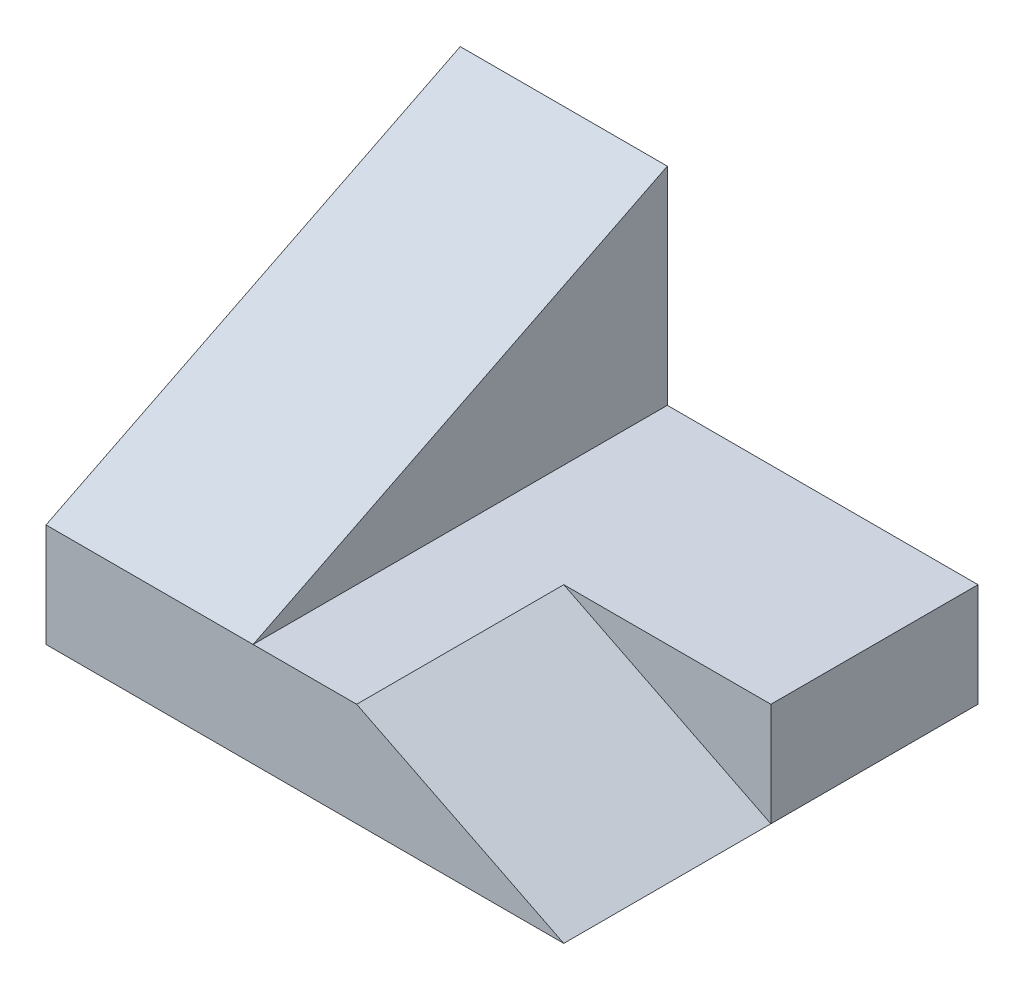
ISO-10303-21;
HEADER;
FILE_DESCRIPTION(('STEP AP214'),'2;1');
FILE_NAME('part.step','',(''),(''),'','','');
FILE_SCHEMA(('AUTOMOTIVE_DESIGN { 1 0 10303 214 1 1 1 1 }'));
ENDSEC;
DATA;
#1=APPLICATION_CONTEXT('core data for automotive mechanical design processes');
#2=APPLICATION_PROTOCOL_DEFINITION('international standard','automotive_design',2000,#1);
#3=PRODUCT_CONTEXT('',#1,'mechanical');
#4=PRODUCT('Part','Part','',(#3));
#5=PRODUCT_RELATED_PRODUCT_CATEGORY('part','',(#4));
#6=PRODUCT_DEFINITION_FORMATION('','',#4);
#7=PRODUCT_DEFINITION_CONTEXT('part definition',#1,'design');
#8=PRODUCT_DEFINITION('design','',#6,#7);
#9=PRODUCT_DEFINITION_SHAPE('','',#8);
#10=(LENGTH_UNIT() NAMED_UNIT(*) SI_UNIT(.MILLI.,.METRE.));
#11=(NAMED_UNIT(*) PLANE_ANGLE_UNIT() SI_UNIT($,.RADIAN.));
#12=(NAMED_UNIT(*) SI_UNIT($,.STERADIAN.) SOLID_ANGLE_UNIT());
#13=UNCERTAINTY_MEASURE_WITH_UNIT(LENGTH_MEASURE(1.E-05),#10,'distance_accuracy_value','');
#14=(GEOMETRIC_REPRESENTATION_CONTEXT(3) GLOBAL_UNCERTAINTY_ASSIGNED_CONTEXT((#13)) GLOBAL_UNIT_ASSIGNED_CONTEXT((#10,
#11,#12)) REPRESENTATION_CONTEXT('',''));
#15=CARTESIAN_POINT('',(0.,0.,0.));
#16=DIRECTION('',(0.,0.,1.));
#17=DIRECTION('',(1.,0.,0.));
#18=AXIS2_PLACEMENT_3D('',#15,#16,#17);
#19=CARTESIAN_POINT('',(127.,25.4,0.));
#20=DIRECTION('',(-1.,0.,0.));
#21=DIRECTION('',(0.,0.,1.));
#22=AXIS2_PLACEMENT_3D('',#19,#20,#21);
#23=PLANE('',#22);
#24=DIRECTION('',(0.,1.,0.));
#25=VECTOR('',#24,1.);
#26=CARTESIAN_POINT('',(127.,25.4,-50.8));
#27=LINE('',#26,#25);
#28=CARTESIAN_POINT('',(127.,0.,-50.8));
#29=VERTEX_POINT('',#28);
#30=CARTESIAN_POINT('',(127.,25.4,-50.8));
#31=VERTEX_POINT('',#30);
#32=EDGE_CURVE('E82',#29,#31,#27,.T.);
#33=ORIENTED_EDGE('',*,*,#32,.F.);
#34=DIRECTION('',(0.,0.,-1.));
#35=VECTOR('',#34,1.);
#36=CARTESIAN_POINT('',(127.,0.,0.));
#37=LINE('',#36,#35);
#38=CARTESIAN_POINT('',(127.,0.,-101.6));
#39=VERTEX_POINT('',#38);
#40=EDGE_CURVE('E78',#29,#39,#37,.T.);
#41=ORIENTED_EDGE('',*,*,#40,.T.);
#42=DIRECTION('',(0.,-1.,0.));
#43=VECTOR('',#42,1.);
#44=CARTESIAN_POINT('',(127.,25.4,-101.6));
#45=LINE('',#44,#43);
#46=CARTESIAN_POINT('',(127.,25.4,-101.6));
#47=VERTEX_POINT('',#46);
#48=EDGE_CURVE('E42',#47,#39,#45,.T.);
#49=ORIENTED_EDGE('',*,*,#48,.F.);
#50=DIRECTION('',(0.,0.,-1.));
#51=VECTOR('',#50,1.);
#52=CARTESIAN_POINT('',(127.,25.4,0.));
#53=LINE('',#52,#51);
#54=EDGE_CURVE('E59',#31,#47,#53,.T.);
#55=ORIENTED_EDGE('',*,*,#54,.F.);
#56=EDGE_LOOP('',(#33,#41,#49,#55));
#57=FACE_BOUND('',#56,.T.);
#58=ADVANCED_FACE('F33',(#57),#23,.F.);
#59=CARTESIAN_POINT('',(0.,25.4,0.));
#60=DIRECTION('',(1.,0.,0.));
#61=DIRECTION('',(0.,0.,-1.));
#62=AXIS2_PLACEMENT_3D('',#59,#60,#61);
#63=PLANE('',#62);
#64=DIRECTION('',(0.,0.,1.));
#65=VECTOR('',#64,1.);
#66=CARTESIAN_POINT('',(0.,0.,0.));
#67=LINE('',#66,#65);
#68=CARTESIAN_POINT('',(0.,0.,-101.6));
#69=VERTEX_POINT('',#68);
#70=CARTESIAN_POINT('',(0.,0.,0.));
#71=VERTEX_POINT('',#70);
#72=EDGE_CURVE('E101',#69,#71,#67,.T.);
#73=ORIENTED_EDGE('',*,*,#72,.T.);
#74=DIRECTION('',(0.,-1.,0.));
#75=VECTOR('',#74,1.);
#76=CARTESIAN_POINT('',(0.,25.4,0.));
#77=LINE('',#76,#75);
#78=CARTESIAN_POINT('',(0.,25.4,0.));
#79=VERTEX_POINT('',#78);
#80=EDGE_CURVE('E11',#79,#71,#77,.T.);
#81=ORIENTED_EDGE('',*,*,#80,.F.);
#82=DIRECTION('',(0.,0.447213595499958,-0.894427190999916));
#83=VECTOR('',#82,1.);
#84=CARTESIAN_POINT('',(0.,76.2,-101.6));
#85=LINE('',#84,#83);
#86=CARTESIAN_POINT('',(0.,76.2,-101.6));
#87=VERTEX_POINT('',#86);
#88=EDGE_CURVE('E133',#79,#87,#85,.T.);
#89=ORIENTED_EDGE('',*,*,#88,.T.);
#90=DIRECTION('',(0.,-1.,0.));
#91=VECTOR('',#90,1.);
#92=CARTESIAN_POINT('',(0.,25.4,-101.6));
#93=LINE('',#92,#91);
#94=EDGE_CURVE('E96',#87,#69,#93,.T.);
#95=ORIENTED_EDGE('',*,*,#94,.T.);
#96=EDGE_LOOP('',(#73,#81,#89,#95));
#97=FACE_BOUND('',#96,.T.);
#98=ADVANCED_FACE('F35',(#97),#63,.F.);
#99=CARTESIAN_POINT('',(0.,25.4,0.));
#100=DIRECTION('',(0.,0.,-1.));
#101=DIRECTION('',(-1.,0.,0.));
#102=AXIS2_PLACEMENT_3D('',#99,#100,#101);
#103=PLANE('',#102);
#104=DIRECTION('',(1.,0.,0.));
#105=VECTOR('',#104,1.);
#106=CARTESIAN_POINT('',(0.,0.,0.));
#107=LINE('',#106,#105);
#108=CARTESIAN_POINT('',(127.,0.,0.));
#109=VERTEX_POINT('',#108);
#110=EDGE_CURVE('E87',#71,#109,#107,.T.);
#111=ORIENTED_EDGE('',*,*,#110,.T.);
#112=DIRECTION('',(0.894427190999916,-0.447213595499958,0.));
#113=VECTOR('',#112,1.);
#114=CARTESIAN_POINT('',(76.2,25.4,0.));
#115=LINE('',#114,#113);
#116=CARTESIAN_POINT('',(76.2,25.4,0.));
#117=VERTEX_POINT('',#116);
#118=EDGE_CURVE('E138',#117,#109,#115,.T.);
#119=ORIENTED_EDGE('',*,*,#118,.F.);
#120=DIRECTION('',(1.,0.,0.));
#121=VECTOR('',#120,1.);
#122=CARTESIAN_POINT('',(0.,25.4,0.));
#123=LINE('',#122,#121);
#124=CARTESIAN_POINT('',(50.8,25.4,0.));
#125=VERTEX_POINT('',#124);
#126=EDGE_CURVE('E102',#125,#117,#123,.T.);
#127=ORIENTED_EDGE('',*,*,#126,.F.);
#128=EDGE_CURVE('E105',#79,#125,#123,.T.);
#129=ORIENTED_EDGE('',*,*,#128,.F.);
#130=ORIENTED_EDGE('',*,*,#80,.T.);
#131=EDGE_LOOP('',(#111,#119,#127,#129,#130));
#132=FACE_BOUND('',#131,.T.);
#133=ADVANCED_FACE('F154',(#132),#103,.F.);
#134=CARTESIAN_POINT('',(0.,25.4,-101.6));
#135=DIRECTION('',(0.,0.,1.));
#136=DIRECTION('',(1.,0.,0.));
#137=AXIS2_PLACEMENT_3D('',#134,#135,#136);
#138=PLANE('',#137);
#139=DIRECTION('',(-1.,0.,0.));
#140=VECTOR('',#139,1.);
#141=CARTESIAN_POINT('',(0.,0.,-101.6));
#142=LINE('',#141,#140);
#143=EDGE_CURVE('E92',#39,#69,#142,.T.);
#144=ORIENTED_EDGE('',*,*,#143,.T.);
#145=ORIENTED_EDGE('',*,*,#94,.F.);
#146=DIRECTION('',(-1.,0.,0.));
#147=VECTOR('',#146,1.);
#148=CARTESIAN_POINT('',(50.8,76.2,-101.6));
#149=LINE('',#148,#147);
#150=CARTESIAN_POINT('',(50.8,76.2,-101.6));
#151=VERTEX_POINT('',#150);
#152=EDGE_CURVE('E124',#151,#87,#149,.T.);
#153=ORIENTED_EDGE('',*,*,#152,.F.);
#154=DIRECTION('',(0.,-1.,0.));
#155=VECTOR('',#154,1.);
#156=CARTESIAN_POINT('',(50.8,25.4,-101.6));
#157=LINE('',#156,#155);
#158=CARTESIAN_POINT('',(50.8,25.4,-101.6));
#159=VERTEX_POINT('',#158);
#160=EDGE_CURVE('E130',#151,#159,#157,.T.);
#161=ORIENTED_EDGE('',*,*,#160,.T.);
#162=DIRECTION('',(-1.,0.,0.));
#163=VECTOR('',#162,1.);
#164=CARTESIAN_POINT('',(0.,25.4,-101.6));
#165=LINE('',#164,#163);
#166=EDGE_CURVE('E95',#47,#159,#165,.T.);
#167=ORIENTED_EDGE('',*,*,#166,.F.);
#168=ORIENTED_EDGE('',*,*,#48,.T.);
#169=EDGE_LOOP('',(#144,#145,#153,#161,#167,#168));
#170=FACE_BOUND('',#169,.T.);
#171=ADVANCED_FACE('F90',(#170),#138,.F.);
#172=CARTESIAN_POINT('',(0.,25.4,0.));
#173=DIRECTION('',(0.,-1.,0.));
#174=DIRECTION('',(0.,0.,-1.));
#175=AXIS2_PLACEMENT_3D('',#172,#173,#174);
#176=PLANE('',#175);
#177=ORIENTED_EDGE('',*,*,#166,.T.);
#178=DIRECTION('',(0.,0.,1.));
#179=VECTOR('',#178,1.);
#180=CARTESIAN_POINT('',(50.8,25.4,-101.6));
#181=LINE('',#180,#179);
#182=EDGE_CURVE('E125',#159,#125,#181,.T.);
#183=ORIENTED_EDGE('',*,*,#182,.T.);
#184=ORIENTED_EDGE('',*,*,#126,.T.);
#185=DIRECTION('',(0.,0.,1.));
#186=VECTOR('',#185,1.);
#187=CARTESIAN_POINT('',(76.2,25.4,-50.8));
#188=LINE('',#187,#186);
#189=CARTESIAN_POINT('',(76.2,25.4,-50.8));
#190=VERTEX_POINT('',#189);
#191=EDGE_CURVE('E116',#190,#117,#188,.T.);
#192=ORIENTED_EDGE('',*,*,#191,.F.);
#193=DIRECTION('',(-1.,0.,0.));
#194=VECTOR('',#193,1.);
#195=CARTESIAN_POINT('',(76.2,25.4,-50.8));
#196=LINE('',#195,#194);
#197=EDGE_CURVE('E140',#31,#190,#196,.T.);
#198=ORIENTED_EDGE('',*,*,#197,.F.);
#199=ORIENTED_EDGE('',*,*,#54,.T.);
#200=EDGE_LOOP('',(#177,#183,#184,#192,#198,#199));
#201=FACE_BOUND('',#200,.T.);
#202=ADVANCED_FACE('F176',(#201),#176,.F.);
#203=CARTESIAN_POINT('',(0.,0.,0.));
#204=DIRECTION('',(0.,-1.,0.));
#205=DIRECTION('',(0.,0.,-1.));
#206=AXIS2_PLACEMENT_3D('',#203,#204,#205);
#207=PLANE('',#206);
#208=ORIENTED_EDGE('',*,*,#72,.F.);
#209=ORIENTED_EDGE('',*,*,#143,.F.);
#210=ORIENTED_EDGE('',*,*,#40,.F.);
#211=EDGE_CURVE('E86',#109,#29,#37,.T.);
#212=ORIENTED_EDGE('',*,*,#211,.F.);
#213=ORIENTED_EDGE('',*,*,#110,.F.);
#214=EDGE_LOOP('',(#208,#209,#210,#212,#213));
#215=FACE_BOUND('',#214,.T.);
#216=ADVANCED_FACE('F99',(#215),#207,.T.);
#217=CARTESIAN_POINT('',(76.2,25.4,-50.8));
#218=DIRECTION('',(-0.447213595499958,-0.894427190999916,0.));
#219=DIRECTION('',(0.894427190999916,-0.447213595499958,0.));
#220=AXIS2_PLACEMENT_3D('',#217,#218,#219);
#221=PLANE('',#220);
#222=ORIENTED_EDGE('',*,*,#118,.T.);
#223=ORIENTED_EDGE('',*,*,#211,.T.);
#224=DIRECTION('',(0.894427190999916,-0.447213595499958,0.));
#225=VECTOR('',#224,1.);
#226=CARTESIAN_POINT('',(76.2,25.4,-50.8));
#227=LINE('',#226,#225);
#228=EDGE_CURVE('E143',#190,#29,#227,.T.);
#229=ORIENTED_EDGE('',*,*,#228,.F.);
#230=ORIENTED_EDGE('',*,*,#191,.T.);
#231=EDGE_LOOP('',(#222,#223,#229,#230));
#232=FACE_BOUND('',#231,.T.);
#233=ADVANCED_FACE('F149',(#232),#221,.F.);
#234=CARTESIAN_POINT('',(0.,0.,-50.8));
#235=DIRECTION('',(0.,0.,1.));
#236=DIRECTION('',(1.,0.,0.));
#237=AXIS2_PLACEMENT_3D('',#234,#235,#236);
#238=PLANE('',#237);
#239=ORIENTED_EDGE('',*,*,#32,.T.);
#240=ORIENTED_EDGE('',*,*,#197,.T.);
#241=ORIENTED_EDGE('',*,*,#228,.T.);
#242=EDGE_LOOP('',(#239,#240,#241));
#243=FACE_BOUND('',#242,.T.);
#244=ADVANCED_FACE('F175',(#243),#238,.T.);
#245=CARTESIAN_POINT('',(50.8,76.2,-101.6));
#246=DIRECTION('',(0.,0.894427190999916,0.447213595499958));
#247=DIRECTION('',(0.,-0.447213595499958,0.894427190999916));
#248=AXIS2_PLACEMENT_3D('',#245,#246,#247);
#249=PLANE('',#248);
#250=ORIENTED_EDGE('',*,*,#88,.F.);
#251=ORIENTED_EDGE('',*,*,#128,.T.);
#252=DIRECTION('',(0.,0.447213595499958,-0.894427190999916));
#253=VECTOR('',#252,1.);
#254=CARTESIAN_POINT('',(50.8,76.2,-101.6));
#255=LINE('',#254,#253);
#256=EDGE_CURVE('E50',#125,#151,#255,.T.);
#257=ORIENTED_EDGE('',*,*,#256,.T.);
#258=ORIENTED_EDGE('',*,*,#152,.T.);
#259=EDGE_LOOP('',(#250,#251,#257,#258));
#260=FACE_BOUND('',#259,.T.);
#261=ADVANCED_FACE('F166',(#260),#249,.T.);
#262=CARTESIAN_POINT('',(50.8,0.,0.));
#263=DIRECTION('',(1.,0.,0.));
#264=DIRECTION('',(0.,0.,-1.));
#265=AXIS2_PLACEMENT_3D('',#262,#263,#264);
#266=PLANE('',#265);
#267=ORIENTED_EDGE('',*,*,#160,.F.);
#268=ORIENTED_EDGE('',*,*,#256,.F.);
#269=ORIENTED_EDGE('',*,*,#182,.F.);
#270=EDGE_LOOP('',(#267,#268,#269));
#271=FACE_BOUND('',#270,.T.);
#272=ADVANCED_FACE('F177',(#271),#266,.T.);
#273=CLOSED_SHELL('',(#58,#98,#133,#171,#202,#216,#233,#244,#261,#272));
#274=MANIFOLD_SOLID_BREP('B2',#273);
#275=ADVANCED_BREP_SHAPE_REPRESENTATION('',(#18,#274),#14);
#276=SHAPE_DEFINITION_REPRESENTATION(#9,#275);
ENDSEC;
END-ISO-10303-21;
